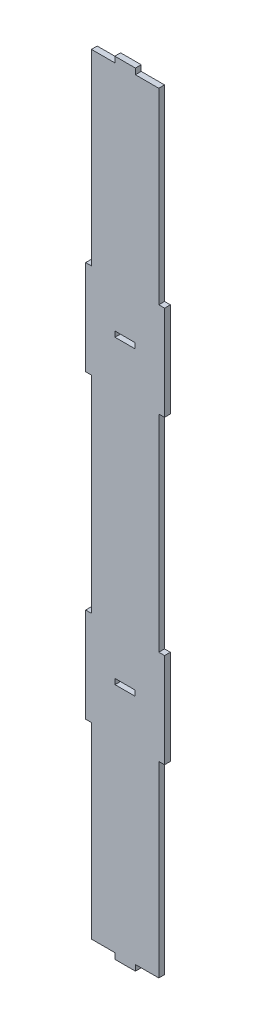
ISO-10303-21;
HEADER;
FILE_DESCRIPTION(('STEP AP214'),'2;1');
FILE_NAME('part.step','',(''),(''),'','','');
FILE_SCHEMA(('AUTOMOTIVE_DESIGN { 1 0 10303 214 1 1 1 1 }'));
ENDSEC;
DATA;
#1=APPLICATION_CONTEXT('core data for automotive mechanical design processes');
#2=APPLICATION_PROTOCOL_DEFINITION('international standard','automotive_design',2000,#1);
#3=PRODUCT_CONTEXT('',#1,'mechanical');
#4=PRODUCT('Part','Part','',(#3));
#5=PRODUCT_RELATED_PRODUCT_CATEGORY('part','',(#4));
#6=PRODUCT_DEFINITION_FORMATION('','',#4);
#7=PRODUCT_DEFINITION_CONTEXT('part definition',#1,'design');
#8=PRODUCT_DEFINITION('design','',#6,#7);
#9=PRODUCT_DEFINITION_SHAPE('','',#8);
#10=(LENGTH_UNIT() NAMED_UNIT(*) SI_UNIT(.MILLI.,.METRE.));
#11=(NAMED_UNIT(*) PLANE_ANGLE_UNIT() SI_UNIT($,.RADIAN.));
#12=(NAMED_UNIT(*) SI_UNIT($,.STERADIAN.) SOLID_ANGLE_UNIT());
#13=UNCERTAINTY_MEASURE_WITH_UNIT(LENGTH_MEASURE(1.E-05),#10,'distance_accuracy_value','');
#14=(GEOMETRIC_REPRESENTATION_CONTEXT(3) GLOBAL_UNCERTAINTY_ASSIGNED_CONTEXT((#13)) GLOBAL_UNIT_ASSIGNED_CONTEXT((#10,
#11,#12)) REPRESENTATION_CONTEXT('',''));
#15=CARTESIAN_POINT('',(0.,0.,0.));
#16=DIRECTION('',(0.,0.,1.));
#17=DIRECTION('',(1.,0.,0.));
#18=AXIS2_PLACEMENT_3D('',#15,#16,#17);
#19=CARTESIAN_POINT('',(0.,0.,4.3));
#20=DIRECTION('',(0.,0.,1.));
#21=DIRECTION('',(1.,0.,0.));
#22=AXIS2_PLACEMENT_3D('',#19,#20,#21);
#23=PLANE('',#22);
#24=DIRECTION('',(-1.,0.,0.));
#25=VECTOR('',#24,1.);
#26=CARTESIAN_POINT('',(7.64999999999997,286.,4.3));
#27=LINE('',#26,#25);
#28=CARTESIAN_POINT('',(24.9999999999999,286.,4.3));
#29=VERTEX_POINT('',#28);
#30=CARTESIAN_POINT('',(7.64999999999997,286.,4.3));
#31=VERTEX_POINT('',#30);
#32=EDGE_CURVE('E336',#29,#31,#27,.T.);
#33=ORIENTED_EDGE('',*,*,#32,.T.);
#34=DIRECTION('',(0.,1.,0.));
#35=VECTOR('',#34,1.);
#36=CARTESIAN_POINT('',(7.64999999999997,286.,4.3));
#37=LINE('',#36,#35);
#38=CARTESIAN_POINT('',(7.65000000000003,290.3,4.3));
#39=VERTEX_POINT('',#38);
#40=EDGE_CURVE('E339',#31,#39,#37,.T.);
#41=ORIENTED_EDGE('',*,*,#40,.T.);
#42=DIRECTION('',(-1.,0.,0.));
#43=VECTOR('',#42,1.);
#44=CARTESIAN_POINT('',(-7.64999999999997,290.3,4.3));
#45=LINE('',#44,#43);
#46=CARTESIAN_POINT('',(-7.64999999999997,290.3,4.3));
#47=VERTEX_POINT('',#46);
#48=EDGE_CURVE('E342',#39,#47,#45,.T.);
#49=ORIENTED_EDGE('',*,*,#48,.T.);
#50=DIRECTION('',(0.,-1.,0.));
#51=VECTOR('',#50,1.);
#52=CARTESIAN_POINT('',(-7.64999999999997,286.,4.3));
#53=LINE('',#52,#51);
#54=CARTESIAN_POINT('',(-7.64999999999997,286.,4.3));
#55=VERTEX_POINT('',#54);
#56=EDGE_CURVE('E344',#47,#55,#53,.T.);
#57=ORIENTED_EDGE('',*,*,#56,.T.);
#58=DIRECTION('',(-1.,0.,0.));
#59=VECTOR('',#58,1.);
#60=CARTESIAN_POINT('',(-24.9999999999999,286.,4.3));
#61=LINE('',#60,#59);
#62=CARTESIAN_POINT('',(-24.9999999999999,286.,4.3));
#63=VERTEX_POINT('',#62);
#64=EDGE_CURVE('E346',#55,#63,#61,.T.);
#65=ORIENTED_EDGE('',*,*,#64,.T.);
#66=DIRECTION('',(0.,-1.,0.));
#67=VECTOR('',#66,1.);
#68=CARTESIAN_POINT('',(-24.9999999999999,146.7667,4.3));
#69=LINE('',#68,#67);
#70=CARTESIAN_POINT('',(-24.9999999999999,146.7667,4.3));
#71=VERTEX_POINT('',#70);
#72=EDGE_CURVE('E348',#63,#71,#69,.T.);
#73=ORIENTED_EDGE('',*,*,#72,.T.);
#74=DIRECTION('',(-1.,0.,0.));
#75=VECTOR('',#74,1.);
#76=CARTESIAN_POINT('',(-24.9999999999999,146.7667,4.3));
#77=LINE('',#76,#75);
#78=CARTESIAN_POINT('',(-29.2999999999999,146.7667,4.3));
#79=VERTEX_POINT('',#78);
#80=EDGE_CURVE('E350',#71,#79,#77,.T.);
#81=ORIENTED_EDGE('',*,*,#80,.T.);
#82=DIRECTION('',(0.,-1.,0.));
#83=VECTOR('',#82,1.);
#84=CARTESIAN_POINT('',(-29.2999999999999,146.7667,4.3));
#85=LINE('',#84,#83);
#86=CARTESIAN_POINT('',(-29.2999999999999,76.5666999999998,4.3));
#87=VERTEX_POINT('',#86);
#88=EDGE_CURVE('E352',#79,#87,#85,.T.);
#89=ORIENTED_EDGE('',*,*,#88,.T.);
#90=DIRECTION('',(1.,0.,0.));
#91=VECTOR('',#90,1.);
#92=CARTESIAN_POINT('',(-24.9999999999999,76.5666999999998,4.3));
#93=LINE('',#92,#91);
#94=CARTESIAN_POINT('',(-24.9999999999999,76.5666999999998,4.3));
#95=VERTEX_POINT('',#94);
#96=EDGE_CURVE('E354',#87,#95,#93,.T.);
#97=ORIENTED_EDGE('',*,*,#96,.T.);
#98=DIRECTION('',(0.,-1.,0.));
#99=VECTOR('',#98,1.);
#100=CARTESIAN_POINT('',(-24.9999999999999,-76.5666000000002,4.3));
#101=LINE('',#100,#99);
#102=CARTESIAN_POINT('',(-24.9999999999999,-76.5666000000002,4.3));
#103=VERTEX_POINT('',#102);
#104=EDGE_CURVE('E356',#95,#103,#101,.T.);
#105=ORIENTED_EDGE('',*,*,#104,.T.);
#106=DIRECTION('',(-1.,0.,0.));
#107=VECTOR('',#106,1.);
#108=CARTESIAN_POINT('',(-24.9999999999999,-76.5666000000002,4.3));
#109=LINE('',#108,#107);
#110=CARTESIAN_POINT('',(-29.2999999999999,-76.5666000000002,4.3));
#111=VERTEX_POINT('',#110);
#112=EDGE_CURVE('E358',#103,#111,#109,.T.);
#113=ORIENTED_EDGE('',*,*,#112,.T.);
#114=DIRECTION('',(0.,-1.,0.));
#115=VECTOR('',#114,1.);
#116=CARTESIAN_POINT('',(-29.2999999999999,-76.5666000000002,4.3));
#117=LINE('',#116,#115);
#118=CARTESIAN_POINT('',(-29.2999999999999,-146.7666,4.3));
#119=VERTEX_POINT('',#118);
#120=EDGE_CURVE('E360',#111,#119,#117,.T.);
#121=ORIENTED_EDGE('',*,*,#120,.T.);
#122=DIRECTION('',(1.,0.,0.));
#123=VECTOR('',#122,1.);
#124=CARTESIAN_POINT('',(-24.9999999999999,-146.7666,4.3));
#125=LINE('',#124,#123);
#126=CARTESIAN_POINT('',(-24.9999999999999,-146.7666,4.3));
#127=VERTEX_POINT('',#126);
#128=EDGE_CURVE('E362',#119,#127,#125,.T.);
#129=ORIENTED_EDGE('',*,*,#128,.T.);
#130=DIRECTION('',(0.,-1.,0.));
#131=VECTOR('',#130,1.);
#132=CARTESIAN_POINT('',(-24.9999999999999,-286.,4.3));
#133=LINE('',#132,#131);
#134=CARTESIAN_POINT('',(-24.9999999999999,-286.,4.3));
#135=VERTEX_POINT('',#134);
#136=EDGE_CURVE('E364',#127,#135,#133,.T.);
#137=ORIENTED_EDGE('',*,*,#136,.T.);
#138=DIRECTION('',(1.,0.,0.));
#139=VECTOR('',#138,1.);
#140=CARTESIAN_POINT('',(-24.9999999999999,-286.,4.3));
#141=LINE('',#140,#139);
#142=CARTESIAN_POINT('',(-7.64999999999982,-286.,4.3));
#143=VERTEX_POINT('',#142);
#144=EDGE_CURVE('E366',#135,#143,#141,.T.);
#145=ORIENTED_EDGE('',*,*,#144,.T.);
#146=DIRECTION('',(0.,-1.,0.));
#147=VECTOR('',#146,1.);
#148=CARTESIAN_POINT('',(-7.64999999999982,-286.,4.3));
#149=LINE('',#148,#147);
#150=CARTESIAN_POINT('',(-7.65000000000008,-290.3,4.3));
#151=VERTEX_POINT('',#150);
#152=EDGE_CURVE('E368',#143,#151,#149,.T.);
#153=ORIENTED_EDGE('',*,*,#152,.T.);
#154=DIRECTION('',(1.,0.,0.));
#155=VECTOR('',#154,1.);
#156=CARTESIAN_POINT('',(-7.65000000000008,-290.3,4.3));
#157=LINE('',#156,#155);
#158=CARTESIAN_POINT('',(7.64999999999992,-290.3,4.3));
#159=VERTEX_POINT('',#158);
#160=EDGE_CURVE('E370',#151,#159,#157,.T.);
#161=ORIENTED_EDGE('',*,*,#160,.T.);
#162=DIRECTION('',(0.,1.,0.));
#163=VECTOR('',#162,1.);
#164=CARTESIAN_POINT('',(7.64999999999992,-286.,4.3));
#165=LINE('',#164,#163);
#166=CARTESIAN_POINT('',(7.64999999999992,-286.,4.3));
#167=VERTEX_POINT('',#166);
#168=EDGE_CURVE('E372',#159,#167,#165,.T.);
#169=ORIENTED_EDGE('',*,*,#168,.T.);
#170=DIRECTION('',(1.,0.,0.));
#171=VECTOR('',#170,1.);
#172=CARTESIAN_POINT('',(7.64999999999992,-286.,4.3));
#173=LINE('',#172,#171);
#174=CARTESIAN_POINT('',(25.0000000000001,-286.,4.3));
#175=VERTEX_POINT('',#174);
#176=EDGE_CURVE('E374',#167,#175,#173,.T.);
#177=ORIENTED_EDGE('',*,*,#176,.T.);
#178=DIRECTION('',(0.,1.,0.));
#179=VECTOR('',#178,1.);
#180=CARTESIAN_POINT('',(25.0000000000001,-286.,4.3));
#181=LINE('',#180,#179);
#182=CARTESIAN_POINT('',(25.,-146.7666,4.3));
#183=VERTEX_POINT('',#182);
#184=EDGE_CURVE('E376',#175,#183,#181,.T.);
#185=ORIENTED_EDGE('',*,*,#184,.T.);
#186=DIRECTION('',(1.,0.,0.));
#187=VECTOR('',#186,1.);
#188=CARTESIAN_POINT('',(25.,-146.7666,4.3));
#189=LINE('',#188,#187);
#190=CARTESIAN_POINT('',(29.3,-146.7666,4.3));
#191=VERTEX_POINT('',#190);
#192=EDGE_CURVE('E378',#183,#191,#189,.T.);
#193=ORIENTED_EDGE('',*,*,#192,.T.);
#194=DIRECTION('',(0.,1.,0.));
#195=VECTOR('',#194,1.);
#196=CARTESIAN_POINT('',(29.3,-76.5666000000002,4.3));
#197=LINE('',#196,#195);
#198=CARTESIAN_POINT('',(29.3,-76.5666000000002,4.3));
#199=VERTEX_POINT('',#198);
#200=EDGE_CURVE('E380',#191,#199,#197,.T.);
#201=ORIENTED_EDGE('',*,*,#200,.T.);
#202=DIRECTION('',(-1.,0.,0.));
#203=VECTOR('',#202,1.);
#204=CARTESIAN_POINT('',(25.,-76.5666000000002,4.3));
#205=LINE('',#204,#203);
#206=CARTESIAN_POINT('',(25.,-76.5666000000002,4.3));
#207=VERTEX_POINT('',#206);
#208=EDGE_CURVE('E382',#199,#207,#205,.T.);
#209=ORIENTED_EDGE('',*,*,#208,.T.);
#210=DIRECTION('',(0.,1.,0.));
#211=VECTOR('',#210,1.);
#212=CARTESIAN_POINT('',(25.,-76.5666000000002,4.3));
#213=LINE('',#212,#211);
#214=CARTESIAN_POINT('',(25.,76.5666999999998,4.3));
#215=VERTEX_POINT('',#214);
#216=EDGE_CURVE('E384',#207,#215,#213,.T.);
#217=ORIENTED_EDGE('',*,*,#216,.T.);
#218=DIRECTION('',(1.,0.,0.));
#219=VECTOR('',#218,1.);
#220=CARTESIAN_POINT('',(25.,76.5666999999998,4.3));
#221=LINE('',#220,#219);
#222=CARTESIAN_POINT('',(29.3,76.5666999999998,4.3));
#223=VERTEX_POINT('',#222);
#224=EDGE_CURVE('E386',#215,#223,#221,.T.);
#225=ORIENTED_EDGE('',*,*,#224,.T.);
#226=DIRECTION('',(0.,1.,0.));
#227=VECTOR('',#226,1.);
#228=CARTESIAN_POINT('',(29.3,146.7667,4.3));
#229=LINE('',#228,#227);
#230=CARTESIAN_POINT('',(29.3,146.7667,4.3));
#231=VERTEX_POINT('',#230);
#232=EDGE_CURVE('E388',#223,#231,#229,.T.);
#233=ORIENTED_EDGE('',*,*,#232,.T.);
#234=DIRECTION('',(-1.,0.,0.));
#235=VECTOR('',#234,1.);
#236=CARTESIAN_POINT('',(25.,146.7667,4.3));
#237=LINE('',#236,#235);
#238=CARTESIAN_POINT('',(25.,146.7667,4.3));
#239=VERTEX_POINT('',#238);
#240=EDGE_CURVE('E390',#231,#239,#237,.T.);
#241=ORIENTED_EDGE('',*,*,#240,.T.);
#242=DIRECTION('',(0.,1.,0.));
#243=VECTOR('',#242,1.);
#244=CARTESIAN_POINT('',(25.,146.7667,4.3));
#245=LINE('',#244,#243);
#246=EDGE_CURVE('E392',#239,#29,#245,.T.);
#247=ORIENTED_EDGE('',*,*,#246,.T.);
#248=EDGE_LOOP('',(#33,#41,#49,#57,#65,#73,#81,#89,#97,#105,#113,#121,#129,#137,#145,#153,#161,
#169,#177,#185,#193,#201,#209,#217,#225,#233,#241,#247));
#249=FACE_BOUND('',#248,.T.);
#250=DIRECTION('',(1.,0.,0.));
#251=VECTOR('',#250,1.);
#252=CARTESIAN_POINT('',(7.50000000000005,-113.6666,4.3));
#253=LINE('',#252,#251);
#254=CARTESIAN_POINT('',(-7.49999999999995,-113.6666,4.3));
#255=VERTEX_POINT('',#254);
#256=CARTESIAN_POINT('',(7.50000000000005,-113.6666,4.3));
#257=VERTEX_POINT('',#256);
#258=EDGE_CURVE('E307',#255,#257,#253,.T.);
#259=ORIENTED_EDGE('',*,*,#258,.F.);
#260=DIRECTION('',(0.,-1.,0.));
#261=VECTOR('',#260,1.);
#262=CARTESIAN_POINT('',(-7.49999999999995,-113.6666,4.3));
#263=LINE('',#262,#261);
#264=CARTESIAN_POINT('',(-7.49999999999995,-109.6666,4.3));
#265=VERTEX_POINT('',#264);
#266=EDGE_CURVE('E305',#265,#255,#263,.T.);
#267=ORIENTED_EDGE('',*,*,#266,.F.);
#268=DIRECTION('',(-1.,0.,0.));
#269=VECTOR('',#268,1.);
#270=CARTESIAN_POINT('',(7.50000000000005,-109.6666,4.3));
#271=LINE('',#270,#269);
#272=CARTESIAN_POINT('',(7.50000000000005,-109.6666,4.3));
#273=VERTEX_POINT('',#272);
#274=EDGE_CURVE('E313',#273,#265,#271,.T.);
#275=ORIENTED_EDGE('',*,*,#274,.F.);
#276=DIRECTION('',(0.,1.,0.));
#277=VECTOR('',#276,1.);
#278=CARTESIAN_POINT('',(7.50000000000005,-113.6666,4.3));
#279=LINE('',#278,#277);
#280=EDGE_CURVE('E310',#257,#273,#279,.T.);
#281=ORIENTED_EDGE('',*,*,#280,.F.);
#282=EDGE_LOOP('',(#259,#267,#275,#281));
#283=FACE_BOUND('',#282,.T.);
#284=DIRECTION('',(-1.,0.,0.));
#285=VECTOR('',#284,1.);
#286=CARTESIAN_POINT('',(7.50000000000002,113.6666,4.3));
#287=LINE('',#286,#285);
#288=CARTESIAN_POINT('',(7.50000000000002,113.6666,4.3));
#289=VERTEX_POINT('',#288);
#290=CARTESIAN_POINT('',(-7.49999999999998,113.6666,4.3));
#291=VERTEX_POINT('',#290);
#292=EDGE_CURVE('E277',#289,#291,#287,.T.);
#293=ORIENTED_EDGE('',*,*,#292,.F.);
#294=DIRECTION('',(0.,1.,0.));
#295=VECTOR('',#294,1.);
#296=CARTESIAN_POINT('',(7.50000000000002,113.6666,4.3));
#297=LINE('',#296,#295);
#298=CARTESIAN_POINT('',(7.50000000000002,109.6666,4.3));
#299=VERTEX_POINT('',#298);
#300=EDGE_CURVE('E269',#299,#289,#297,.T.);
#301=ORIENTED_EDGE('',*,*,#300,.F.);
#302=DIRECTION('',(1.,0.,0.));
#303=VECTOR('',#302,1.);
#304=CARTESIAN_POINT('',(7.50000000000002,109.6666,4.3));
#305=LINE('',#304,#303);
#306=CARTESIAN_POINT('',(-7.49999999999998,109.6666,4.3));
#307=VERTEX_POINT('',#306);
#308=EDGE_CURVE('E291',#307,#299,#305,.T.);
#309=ORIENTED_EDGE('',*,*,#308,.F.);
#310=DIRECTION('',(0.,-1.,0.));
#311=VECTOR('',#310,1.);
#312=CARTESIAN_POINT('',(-7.49999999999998,113.6666,4.3));
#313=LINE('',#312,#311);
#314=EDGE_CURVE('E289',#291,#307,#313,.T.);
#315=ORIENTED_EDGE('',*,*,#314,.F.);
#316=EDGE_LOOP('',(#293,#301,#309,#315));
#317=FACE_BOUND('',#316,.T.);
#318=ADVANCED_FACE('F36',(#249,#283,#317),#23,.T.);
#319=CARTESIAN_POINT('',(0.,0.,0.));
#320=DIRECTION('',(0.,0.,1.));
#321=DIRECTION('',(1.,0.,0.));
#322=AXIS2_PLACEMENT_3D('',#319,#320,#321);
#323=PLANE('',#322);
#324=DIRECTION('',(0.,-1.,0.));
#325=VECTOR('',#324,1.);
#326=CARTESIAN_POINT('',(-7.49999999999995,-113.6666,0.));
#327=LINE('',#326,#325);
#328=CARTESIAN_POINT('',(-7.49999999999995,-109.6666,0.));
#329=VERTEX_POINT('',#328);
#330=CARTESIAN_POINT('',(-7.49999999999995,-113.6666,0.));
#331=VERTEX_POINT('',#330);
#332=EDGE_CURVE('E285',#329,#331,#327,.T.);
#333=ORIENTED_EDGE('',*,*,#332,.T.);
#334=DIRECTION('',(1.,0.,0.));
#335=VECTOR('',#334,1.);
#336=CARTESIAN_POINT('',(7.50000000000005,-113.6666,0.));
#337=LINE('',#336,#335);
#338=CARTESIAN_POINT('',(7.50000000000005,-113.6666,0.));
#339=VERTEX_POINT('',#338);
#340=EDGE_CURVE('E318',#331,#339,#337,.T.);
#341=ORIENTED_EDGE('',*,*,#340,.T.);
#342=DIRECTION('',(0.,1.,0.));
#343=VECTOR('',#342,1.);
#344=CARTESIAN_POINT('',(7.50000000000005,-113.6666,0.));
#345=LINE('',#344,#343);
#346=CARTESIAN_POINT('',(7.50000000000005,-109.6666,0.));
#347=VERTEX_POINT('',#346);
#348=EDGE_CURVE('E321',#339,#347,#345,.T.);
#349=ORIENTED_EDGE('',*,*,#348,.T.);
#350=DIRECTION('',(-1.,0.,0.));
#351=VECTOR('',#350,1.);
#352=CARTESIAN_POINT('',(7.50000000000005,-109.6666,0.));
#353=LINE('',#352,#351);
#354=EDGE_CURVE('E308',#347,#329,#353,.T.);
#355=ORIENTED_EDGE('',*,*,#354,.T.);
#356=EDGE_LOOP('',(#333,#341,#349,#355));
#357=FACE_BOUND('',#356,.T.);
#358=DIRECTION('',(-1.,0.,0.));
#359=VECTOR('',#358,1.);
#360=CARTESIAN_POINT('',(7.64999999999997,286.,0.));
#361=LINE('',#360,#359);
#362=CARTESIAN_POINT('',(24.9999999999999,286.,0.));
#363=VERTEX_POINT('',#362);
#364=CARTESIAN_POINT('',(7.64999999999997,286.,0.));
#365=VERTEX_POINT('',#364);
#366=EDGE_CURVE('E335',#363,#365,#361,.T.);
#367=ORIENTED_EDGE('',*,*,#366,.F.);
#368=DIRECTION('',(0.,1.,0.));
#369=VECTOR('',#368,1.);
#370=CARTESIAN_POINT('',(25.,146.7667,0.));
#371=LINE('',#370,#369);
#372=CARTESIAN_POINT('',(25.,146.7667,0.));
#373=VERTEX_POINT('',#372);
#374=EDGE_CURVE('E340',#373,#363,#371,.T.);
#375=ORIENTED_EDGE('',*,*,#374,.F.);
#376=DIRECTION('',(-1.,0.,0.));
#377=VECTOR('',#376,1.);
#378=CARTESIAN_POINT('',(25.,146.7667,0.));
#379=LINE('',#378,#377);
#380=CARTESIAN_POINT('',(29.3,146.7667,0.));
#381=VERTEX_POINT('',#380);
#382=EDGE_CURVE('E447',#381,#373,#379,.T.);
#383=ORIENTED_EDGE('',*,*,#382,.F.);
#384=DIRECTION('',(0.,1.,0.));
#385=VECTOR('',#384,1.);
#386=CARTESIAN_POINT('',(29.3,146.7667,0.));
#387=LINE('',#386,#385);
#388=CARTESIAN_POINT('',(29.3,76.5666999999998,0.));
#389=VERTEX_POINT('',#388);
#390=EDGE_CURVE('E445',#389,#381,#387,.T.);
#391=ORIENTED_EDGE('',*,*,#390,.F.);
#392=DIRECTION('',(1.,0.,0.));
#393=VECTOR('',#392,1.);
#394=CARTESIAN_POINT('',(25.,76.5666999999998,0.));
#395=LINE('',#394,#393);
#396=CARTESIAN_POINT('',(25.,76.5666999999998,0.));
#397=VERTEX_POINT('',#396);
#398=EDGE_CURVE('E443',#397,#389,#395,.T.);
#399=ORIENTED_EDGE('',*,*,#398,.F.);
#400=DIRECTION('',(0.,1.,0.));
#401=VECTOR('',#400,1.);
#402=CARTESIAN_POINT('',(25.,-76.5666000000002,0.));
#403=LINE('',#402,#401);
#404=CARTESIAN_POINT('',(25.,-76.5666000000002,0.));
#405=VERTEX_POINT('',#404);
#406=EDGE_CURVE('E441',#405,#397,#403,.T.);
#407=ORIENTED_EDGE('',*,*,#406,.F.);
#408=DIRECTION('',(-1.,0.,0.));
#409=VECTOR('',#408,1.);
#410=CARTESIAN_POINT('',(25.,-76.5666000000002,0.));
#411=LINE('',#410,#409);
#412=CARTESIAN_POINT('',(29.3,-76.5666000000002,0.));
#413=VERTEX_POINT('',#412);
#414=EDGE_CURVE('E439',#413,#405,#411,.T.);
#415=ORIENTED_EDGE('',*,*,#414,.F.);
#416=DIRECTION('',(0.,1.,0.));
#417=VECTOR('',#416,1.);
#418=CARTESIAN_POINT('',(29.3,-76.5666000000002,0.));
#419=LINE('',#418,#417);
#420=CARTESIAN_POINT('',(29.3,-146.7666,0.));
#421=VERTEX_POINT('',#420);
#422=EDGE_CURVE('E437',#421,#413,#419,.T.);
#423=ORIENTED_EDGE('',*,*,#422,.F.);
#424=DIRECTION('',(1.,0.,0.));
#425=VECTOR('',#424,1.);
#426=CARTESIAN_POINT('',(25.,-146.7666,0.));
#427=LINE('',#426,#425);
#428=CARTESIAN_POINT('',(25.,-146.7666,0.));
#429=VERTEX_POINT('',#428);
#430=EDGE_CURVE('E435',#429,#421,#427,.T.);
#431=ORIENTED_EDGE('',*,*,#430,.F.);
#432=DIRECTION('',(0.,1.,0.));
#433=VECTOR('',#432,1.);
#434=CARTESIAN_POINT('',(25.0000000000001,-286.,0.));
#435=LINE('',#434,#433);
#436=CARTESIAN_POINT('',(25.0000000000001,-286.,0.));
#437=VERTEX_POINT('',#436);
#438=EDGE_CURVE('E433',#437,#429,#435,.T.);
#439=ORIENTED_EDGE('',*,*,#438,.F.);
#440=DIRECTION('',(1.,0.,0.));
#441=VECTOR('',#440,1.);
#442=CARTESIAN_POINT('',(7.64999999999992,-286.,0.));
#443=LINE('',#442,#441);
#444=CARTESIAN_POINT('',(7.64999999999992,-286.,0.));
#445=VERTEX_POINT('',#444);
#446=EDGE_CURVE('E431',#445,#437,#443,.T.);
#447=ORIENTED_EDGE('',*,*,#446,.F.);
#448=DIRECTION('',(0.,1.,0.));
#449=VECTOR('',#448,1.);
#450=CARTESIAN_POINT('',(7.64999999999992,-286.,0.));
#451=LINE('',#450,#449);
#452=CARTESIAN_POINT('',(7.64999999999992,-290.3,0.));
#453=VERTEX_POINT('',#452);
#454=EDGE_CURVE('E429',#453,#445,#451,.T.);
#455=ORIENTED_EDGE('',*,*,#454,.F.);
#456=DIRECTION('',(1.,0.,0.));
#457=VECTOR('',#456,1.);
#458=CARTESIAN_POINT('',(-7.65000000000008,-290.3,0.));
#459=LINE('',#458,#457);
#460=CARTESIAN_POINT('',(-7.65000000000008,-290.3,0.));
#461=VERTEX_POINT('',#460);
#462=EDGE_CURVE('E427',#461,#453,#459,.T.);
#463=ORIENTED_EDGE('',*,*,#462,.F.);
#464=DIRECTION('',(0.,-1.,0.));
#465=VECTOR('',#464,1.);
#466=CARTESIAN_POINT('',(-7.64999999999982,-286.,0.));
#467=LINE('',#466,#465);
#468=CARTESIAN_POINT('',(-7.64999999999982,-286.,0.));
#469=VERTEX_POINT('',#468);
#470=EDGE_CURVE('E425',#469,#461,#467,.T.);
#471=ORIENTED_EDGE('',*,*,#470,.F.);
#472=DIRECTION('',(1.,0.,0.));
#473=VECTOR('',#472,1.);
#474=CARTESIAN_POINT('',(-24.9999999999999,-286.,0.));
#475=LINE('',#474,#473);
#476=CARTESIAN_POINT('',(-24.9999999999999,-286.,0.));
#477=VERTEX_POINT('',#476);
#478=EDGE_CURVE('E423',#477,#469,#475,.T.);
#479=ORIENTED_EDGE('',*,*,#478,.F.);
#480=DIRECTION('',(0.,-1.,0.));
#481=VECTOR('',#480,1.);
#482=CARTESIAN_POINT('',(-24.9999999999999,-286.,0.));
#483=LINE('',#482,#481);
#484=CARTESIAN_POINT('',(-24.9999999999999,-146.7666,0.));
#485=VERTEX_POINT('',#484);
#486=EDGE_CURVE('E421',#485,#477,#483,.T.);
#487=ORIENTED_EDGE('',*,*,#486,.F.);
#488=DIRECTION('',(1.,0.,0.));
#489=VECTOR('',#488,1.);
#490=CARTESIAN_POINT('',(-24.9999999999999,-146.7666,0.));
#491=LINE('',#490,#489);
#492=CARTESIAN_POINT('',(-29.2999999999999,-146.7666,0.));
#493=VERTEX_POINT('',#492);
#494=EDGE_CURVE('E419',#493,#485,#491,.T.);
#495=ORIENTED_EDGE('',*,*,#494,.F.);
#496=DIRECTION('',(0.,-1.,0.));
#497=VECTOR('',#496,1.);
#498=CARTESIAN_POINT('',(-29.2999999999999,-76.5666000000002,0.));
#499=LINE('',#498,#497);
#500=CARTESIAN_POINT('',(-29.2999999999999,-76.5666000000002,0.));
#501=VERTEX_POINT('',#500);
#502=EDGE_CURVE('E417',#501,#493,#499,.T.);
#503=ORIENTED_EDGE('',*,*,#502,.F.);
#504=DIRECTION('',(-1.,0.,0.));
#505=VECTOR('',#504,1.);
#506=CARTESIAN_POINT('',(-24.9999999999999,-76.5666000000002,0.));
#507=LINE('',#506,#505);
#508=CARTESIAN_POINT('',(-24.9999999999999,-76.5666000000002,0.));
#509=VERTEX_POINT('',#508);
#510=EDGE_CURVE('E415',#509,#501,#507,.T.);
#511=ORIENTED_EDGE('',*,*,#510,.F.);
#512=DIRECTION('',(0.,-1.,0.));
#513=VECTOR('',#512,1.);
#514=CARTESIAN_POINT('',(-24.9999999999999,-76.5666000000002,0.));
#515=LINE('',#514,#513);
#516=CARTESIAN_POINT('',(-24.9999999999999,76.5666999999998,0.));
#517=VERTEX_POINT('',#516);
#518=EDGE_CURVE('E413',#517,#509,#515,.T.);
#519=ORIENTED_EDGE('',*,*,#518,.F.);
#520=DIRECTION('',(1.,0.,0.));
#521=VECTOR('',#520,1.);
#522=CARTESIAN_POINT('',(-24.9999999999999,76.5666999999998,0.));
#523=LINE('',#522,#521);
#524=CARTESIAN_POINT('',(-29.2999999999999,76.5666999999998,0.));
#525=VERTEX_POINT('',#524);
#526=EDGE_CURVE('E411',#525,#517,#523,.T.);
#527=ORIENTED_EDGE('',*,*,#526,.F.);
#528=DIRECTION('',(0.,-1.,0.));
#529=VECTOR('',#528,1.);
#530=CARTESIAN_POINT('',(-29.2999999999999,146.7667,0.));
#531=LINE('',#530,#529);
#532=CARTESIAN_POINT('',(-29.2999999999999,146.7667,0.));
#533=VERTEX_POINT('',#532);
#534=EDGE_CURVE('E409',#533,#525,#531,.T.);
#535=ORIENTED_EDGE('',*,*,#534,.F.);
#536=DIRECTION('',(-1.,0.,0.));
#537=VECTOR('',#536,1.);
#538=CARTESIAN_POINT('',(-24.9999999999999,146.7667,0.));
#539=LINE('',#538,#537);
#540=CARTESIAN_POINT('',(-24.9999999999999,146.7667,0.));
#541=VERTEX_POINT('',#540);
#542=EDGE_CURVE('E407',#541,#533,#539,.T.);
#543=ORIENTED_EDGE('',*,*,#542,.F.);
#544=DIRECTION('',(0.,-1.,0.));
#545=VECTOR('',#544,1.);
#546=CARTESIAN_POINT('',(-24.9999999999999,146.7667,0.));
#547=LINE('',#546,#545);
#548=CARTESIAN_POINT('',(-24.9999999999999,286.,0.));
#549=VERTEX_POINT('',#548);
#550=EDGE_CURVE('E405',#549,#541,#547,.T.);
#551=ORIENTED_EDGE('',*,*,#550,.F.);
#552=DIRECTION('',(-1.,0.,0.));
#553=VECTOR('',#552,1.);
#554=CARTESIAN_POINT('',(-24.9999999999999,286.,0.));
#555=LINE('',#554,#553);
#556=CARTESIAN_POINT('',(-7.64999999999997,286.,0.));
#557=VERTEX_POINT('',#556);
#558=EDGE_CURVE('E403',#557,#549,#555,.T.);
#559=ORIENTED_EDGE('',*,*,#558,.F.);
#560=DIRECTION('',(0.,-1.,0.));
#561=VECTOR('',#560,1.);
#562=CARTESIAN_POINT('',(-7.64999999999997,286.,0.));
#563=LINE('',#562,#561);
#564=CARTESIAN_POINT('',(-7.64999999999997,290.3,0.));
#565=VERTEX_POINT('',#564);
#566=EDGE_CURVE('E401',#565,#557,#563,.T.);
#567=ORIENTED_EDGE('',*,*,#566,.F.);
#568=DIRECTION('',(-1.,0.,0.));
#569=VECTOR('',#568,1.);
#570=CARTESIAN_POINT('',(-7.64999999999997,290.3,0.));
#571=LINE('',#570,#569);
#572=CARTESIAN_POINT('',(7.65000000000003,290.3,0.));
#573=VERTEX_POINT('',#572);
#574=EDGE_CURVE('E399',#573,#565,#571,.T.);
#575=ORIENTED_EDGE('',*,*,#574,.F.);
#576=DIRECTION('',(0.,1.,0.));
#577=VECTOR('',#576,1.);
#578=CARTESIAN_POINT('',(7.64999999999997,286.,0.));
#579=LINE('',#578,#577);
#580=EDGE_CURVE('E397',#365,#573,#579,.T.);
#581=ORIENTED_EDGE('',*,*,#580,.F.);
#582=EDGE_LOOP('',(#367,#375,#383,#391,#399,#407,#415,#423,#431,#439,#447,#455,#463,#471,#479,
#487,#495,#503,#511,#519,#527,#535,#543,#551,#559,#567,#575,#581));
#583=FACE_BOUND('',#582,.T.);
#584=DIRECTION('',(0.,1.,0.));
#585=VECTOR('',#584,1.);
#586=CARTESIAN_POINT('',(7.50000000000002,113.6666,0.));
#587=LINE('',#586,#585);
#588=CARTESIAN_POINT('',(7.50000000000002,109.6666,0.));
#589=VERTEX_POINT('',#588);
#590=CARTESIAN_POINT('',(7.50000000000002,113.6666,0.));
#591=VERTEX_POINT('',#590);
#592=EDGE_CURVE('E59',#589,#591,#587,.T.);
#593=ORIENTED_EDGE('',*,*,#592,.T.);
#594=DIRECTION('',(-1.,0.,0.));
#595=VECTOR('',#594,1.);
#596=CARTESIAN_POINT('',(7.50000000000002,113.6666,0.));
#597=LINE('',#596,#595);
#598=CARTESIAN_POINT('',(-7.49999999999998,113.6666,0.));
#599=VERTEX_POINT('',#598);
#600=EDGE_CURVE('E284',#591,#599,#597,.T.);
#601=ORIENTED_EDGE('',*,*,#600,.T.);
#602=DIRECTION('',(0.,-1.,0.));
#603=VECTOR('',#602,1.);
#604=CARTESIAN_POINT('',(-7.49999999999998,113.6666,0.));
#605=LINE('',#604,#603);
#606=CARTESIAN_POINT('',(-7.49999999999998,109.6666,0.));
#607=VERTEX_POINT('',#606);
#608=EDGE_CURVE('E297',#599,#607,#605,.T.);
#609=ORIENTED_EDGE('',*,*,#608,.T.);
#610=DIRECTION('',(1.,0.,0.));
#611=VECTOR('',#610,1.);
#612=CARTESIAN_POINT('',(7.50000000000002,109.6666,0.));
#613=LINE('',#612,#611);
#614=EDGE_CURVE('E278',#607,#589,#613,.T.);
#615=ORIENTED_EDGE('',*,*,#614,.T.);
#616=EDGE_LOOP('',(#593,#601,#609,#615));
#617=FACE_BOUND('',#616,.T.);
#618=ADVANCED_FACE('F537',(#357,#583,#617),#323,.F.);
#619=CARTESIAN_POINT('',(7.64999999999997,286.,4.3));
#620=DIRECTION('',(0.,-1.,0.));
#621=DIRECTION('',(0.,0.,-1.));
#622=AXIS2_PLACEMENT_3D('',#619,#620,#621);
#623=PLANE('',#622);
#624=ORIENTED_EDGE('',*,*,#366,.T.);
#625=DIRECTION('',(0.,0.,-1.));
#626=VECTOR('',#625,1.);
#627=CARTESIAN_POINT('',(7.64999999999997,286.,4.3));
#628=LINE('',#627,#626);
#629=EDGE_CURVE('E11',#31,#365,#628,.T.);
#630=ORIENTED_EDGE('',*,*,#629,.F.);
#631=ORIENTED_EDGE('',*,*,#32,.F.);
#632=DIRECTION('',(0.,0.,-1.));
#633=VECTOR('',#632,1.);
#634=CARTESIAN_POINT('',(24.9999999999999,286.,4.3));
#635=LINE('',#634,#633);
#636=EDGE_CURVE('E394',#29,#363,#635,.T.);
#637=ORIENTED_EDGE('',*,*,#636,.T.);
#638=EDGE_LOOP('',(#624,#630,#631,#637));
#639=FACE_BOUND('',#638,.T.);
#640=ADVANCED_FACE('F38',(#639),#623,.F.);
#641=CARTESIAN_POINT('',(7.64999999999997,286.,4.3));
#642=DIRECTION('',(-1.,0.,0.));
#643=DIRECTION('',(0.,-1.,0.));
#644=AXIS2_PLACEMENT_3D('',#641,#642,#643);
#645=PLANE('',#644);
#646=ORIENTED_EDGE('',*,*,#580,.T.);
#647=DIRECTION('',(0.,0.,-1.));
#648=VECTOR('',#647,1.);
#649=CARTESIAN_POINT('',(7.65000000000003,290.3,4.3));
#650=LINE('',#649,#648);
#651=EDGE_CURVE('E44',#39,#573,#650,.T.);
#652=ORIENTED_EDGE('',*,*,#651,.F.);
#653=ORIENTED_EDGE('',*,*,#40,.F.);
#654=ORIENTED_EDGE('',*,*,#629,.T.);
#655=EDGE_LOOP('',(#646,#652,#653,#654));
#656=FACE_BOUND('',#655,.T.);
#657=ADVANCED_FACE('F555',(#656),#645,.F.);
#658=CARTESIAN_POINT('',(-7.64999999999997,290.3,4.3));
#659=DIRECTION('',(0.,-1.,0.));
#660=DIRECTION('',(0.,0.,-1.));
#661=AXIS2_PLACEMENT_3D('',#658,#659,#660);
#662=PLANE('',#661);
#663=ORIENTED_EDGE('',*,*,#574,.T.);
#664=DIRECTION('',(0.,0.,-1.));
#665=VECTOR('',#664,1.);
#666=CARTESIAN_POINT('',(-7.64999999999997,290.3,4.3));
#667=LINE('',#666,#665);
#668=EDGE_CURVE('E524',#47,#565,#667,.T.);
#669=ORIENTED_EDGE('',*,*,#668,.F.);
#670=ORIENTED_EDGE('',*,*,#48,.F.);
#671=ORIENTED_EDGE('',*,*,#651,.T.);
#672=EDGE_LOOP('',(#663,#669,#670,#671));
#673=FACE_BOUND('',#672,.T.);
#674=ADVANCED_FACE('F531',(#673),#662,.F.);
#675=CARTESIAN_POINT('',(-7.64999999999997,286.,4.3));
#676=DIRECTION('',(1.,0.,0.));
#677=DIRECTION('',(0.,0.,-1.));
#678=AXIS2_PLACEMENT_3D('',#675,#676,#677);
#679=PLANE('',#678);
#680=ORIENTED_EDGE('',*,*,#566,.T.);
#681=DIRECTION('',(0.,0.,-1.));
#682=VECTOR('',#681,1.);
#683=CARTESIAN_POINT('',(-7.64999999999997,286.,4.3));
#684=LINE('',#683,#682);
#685=EDGE_CURVE('E521',#55,#557,#684,.T.);
#686=ORIENTED_EDGE('',*,*,#685,.F.);
#687=ORIENTED_EDGE('',*,*,#56,.F.);
#688=ORIENTED_EDGE('',*,*,#668,.T.);
#689=EDGE_LOOP('',(#680,#686,#687,#688));
#690=FACE_BOUND('',#689,.T.);
#691=ADVANCED_FACE('F543',(#690),#679,.F.);
#692=CARTESIAN_POINT('',(-24.9999999999999,286.,4.3));
#693=DIRECTION('',(0.,-1.,0.));
#694=DIRECTION('',(0.,0.,-1.));
#695=AXIS2_PLACEMENT_3D('',#692,#693,#694);
#696=PLANE('',#695);
#697=ORIENTED_EDGE('',*,*,#558,.T.);
#698=DIRECTION('',(0.,0.,-1.));
#699=VECTOR('',#698,1.);
#700=CARTESIAN_POINT('',(-24.9999999999999,286.,4.3));
#701=LINE('',#700,#699);
#702=EDGE_CURVE('E518',#63,#549,#701,.T.);
#703=ORIENTED_EDGE('',*,*,#702,.F.);
#704=ORIENTED_EDGE('',*,*,#64,.F.);
#705=ORIENTED_EDGE('',*,*,#685,.T.);
#706=EDGE_LOOP('',(#697,#703,#704,#705));
#707=FACE_BOUND('',#706,.T.);
#708=ADVANCED_FACE('F547',(#707),#696,.F.);
#709=CARTESIAN_POINT('',(-24.9999999999999,146.7667,4.3));
#710=DIRECTION('',(1.,0.,0.));
#711=DIRECTION('',(0.,1.,0.));
#712=AXIS2_PLACEMENT_3D('',#709,#710,#711);
#713=PLANE('',#712);
#714=ORIENTED_EDGE('',*,*,#550,.T.);
#715=DIRECTION('',(0.,0.,-1.));
#716=VECTOR('',#715,1.);
#717=CARTESIAN_POINT('',(-24.9999999999999,146.7667,4.3));
#718=LINE('',#717,#716);
#719=EDGE_CURVE('E515',#71,#541,#718,.T.);
#720=ORIENTED_EDGE('',*,*,#719,.F.);
#721=ORIENTED_EDGE('',*,*,#72,.F.);
#722=ORIENTED_EDGE('',*,*,#702,.T.);
#723=EDGE_LOOP('',(#714,#720,#721,#722));
#724=FACE_BOUND('',#723,.T.);
#725=ADVANCED_FACE('F668',(#724),#713,.F.);
#726=CARTESIAN_POINT('',(-24.9999999999999,146.7667,4.3));
#727=DIRECTION('',(0.,-1.,0.));
#728=DIRECTION('',(0.,0.,-1.));
#729=AXIS2_PLACEMENT_3D('',#726,#727,#728);
#730=PLANE('',#729);
#731=ORIENTED_EDGE('',*,*,#542,.T.);
#732=DIRECTION('',(0.,0.,-1.));
#733=VECTOR('',#732,1.);
#734=CARTESIAN_POINT('',(-29.2999999999999,146.7667,4.3));
#735=LINE('',#734,#733);
#736=EDGE_CURVE('E512',#79,#533,#735,.T.);
#737=ORIENTED_EDGE('',*,*,#736,.F.);
#738=ORIENTED_EDGE('',*,*,#80,.F.);
#739=ORIENTED_EDGE('',*,*,#719,.T.);
#740=EDGE_LOOP('',(#731,#737,#738,#739));
#741=FACE_BOUND('',#740,.T.);
#742=ADVANCED_FACE('F665',(#741),#730,.F.);
#743=CARTESIAN_POINT('',(-29.2999999999999,146.7667,4.3));
#744=DIRECTION('',(1.,0.,0.));
#745=DIRECTION('',(0.,0.,-1.));
#746=AXIS2_PLACEMENT_3D('',#743,#744,#745);
#747=PLANE('',#746);
#748=ORIENTED_EDGE('',*,*,#534,.T.);
#749=DIRECTION('',(0.,0.,-1.));
#750=VECTOR('',#749,1.);
#751=CARTESIAN_POINT('',(-29.2999999999999,76.5666999999998,4.3));
#752=LINE('',#751,#750);
#753=EDGE_CURVE('E509',#87,#525,#752,.T.);
#754=ORIENTED_EDGE('',*,*,#753,.F.);
#755=ORIENTED_EDGE('',*,*,#88,.F.);
#756=ORIENTED_EDGE('',*,*,#736,.T.);
#757=EDGE_LOOP('',(#748,#754,#755,#756));
#758=FACE_BOUND('',#757,.T.);
#759=ADVANCED_FACE('F661',(#758),#747,.F.);
#760=CARTESIAN_POINT('',(-24.9999999999999,76.5666999999998,4.3));
#761=DIRECTION('',(0.,1.,0.));
#762=DIRECTION('',(-1.,0.,0.));
#763=AXIS2_PLACEMENT_3D('',#760,#761,#762);
#764=PLANE('',#763);
#765=ORIENTED_EDGE('',*,*,#526,.T.);
#766=DIRECTION('',(0.,0.,-1.));
#767=VECTOR('',#766,1.);
#768=CARTESIAN_POINT('',(-24.9999999999999,76.5666999999998,4.3));
#769=LINE('',#768,#767);
#770=EDGE_CURVE('E506',#95,#517,#769,.T.);
#771=ORIENTED_EDGE('',*,*,#770,.F.);
#772=ORIENTED_EDGE('',*,*,#96,.F.);
#773=ORIENTED_EDGE('',*,*,#753,.T.);
#774=EDGE_LOOP('',(#765,#771,#772,#773));
#775=FACE_BOUND('',#774,.T.);
#776=ADVANCED_FACE('F657',(#775),#764,.F.);
#777=CARTESIAN_POINT('',(-24.9999999999999,-76.5666000000002,4.3));
#778=DIRECTION('',(1.,0.,0.));
#779=DIRECTION('',(0.,0.,-1.));
#780=AXIS2_PLACEMENT_3D('',#777,#778,#779);
#781=PLANE('',#780);
#782=ORIENTED_EDGE('',*,*,#518,.T.);
#783=DIRECTION('',(0.,0.,-1.));
#784=VECTOR('',#783,1.);
#785=CARTESIAN_POINT('',(-24.9999999999999,-76.5666000000002,4.3));
#786=LINE('',#785,#784);
#787=EDGE_CURVE('E503',#103,#509,#786,.T.);
#788=ORIENTED_EDGE('',*,*,#787,.F.);
#789=ORIENTED_EDGE('',*,*,#104,.F.);
#790=ORIENTED_EDGE('',*,*,#770,.T.);
#791=EDGE_LOOP('',(#782,#788,#789,#790));
#792=FACE_BOUND('',#791,.T.);
#793=ADVANCED_FACE('F652',(#792),#781,.F.);
#794=CARTESIAN_POINT('',(-24.9999999999999,-76.5666000000002,4.3));
#795=DIRECTION('',(0.,-1.,0.));
#796=DIRECTION('',(0.,0.,-1.));
#797=AXIS2_PLACEMENT_3D('',#794,#795,#796);
#798=PLANE('',#797);
#799=ORIENTED_EDGE('',*,*,#510,.T.);
#800=DIRECTION('',(0.,0.,-1.));
#801=VECTOR('',#800,1.);
#802=CARTESIAN_POINT('',(-29.2999999999999,-76.5666000000002,4.3));
#803=LINE('',#802,#801);
#804=EDGE_CURVE('E500',#111,#501,#803,.T.);
#805=ORIENTED_EDGE('',*,*,#804,.F.);
#806=ORIENTED_EDGE('',*,*,#112,.F.);
#807=ORIENTED_EDGE('',*,*,#787,.T.);
#808=EDGE_LOOP('',(#799,#805,#806,#807));
#809=FACE_BOUND('',#808,.T.);
#810=ADVANCED_FACE('F646',(#809),#798,.F.);
#811=CARTESIAN_POINT('',(-29.2999999999999,-76.5666000000002,4.3));
#812=DIRECTION('',(1.,0.,0.));
#813=DIRECTION('',(0.,0.,-1.));
#814=AXIS2_PLACEMENT_3D('',#811,#812,#813);
#815=PLANE('',#814);
#816=ORIENTED_EDGE('',*,*,#502,.T.);
#817=DIRECTION('',(0.,0.,-1.));
#818=VECTOR('',#817,1.);
#819=CARTESIAN_POINT('',(-29.2999999999999,-146.7666,4.3));
#820=LINE('',#819,#818);
#821=EDGE_CURVE('E497',#119,#493,#820,.T.);
#822=ORIENTED_EDGE('',*,*,#821,.F.);
#823=ORIENTED_EDGE('',*,*,#120,.F.);
#824=ORIENTED_EDGE('',*,*,#804,.T.);
#825=EDGE_LOOP('',(#816,#822,#823,#824));
#826=FACE_BOUND('',#825,.T.);
#827=ADVANCED_FACE('F642',(#826),#815,.F.);
#828=CARTESIAN_POINT('',(-24.9999999999999,-146.7666,4.3));
#829=DIRECTION('',(0.,1.,0.));
#830=DIRECTION('',(0.,0.,1.));
#831=AXIS2_PLACEMENT_3D('',#828,#829,#830);
#832=PLANE('',#831);
#833=ORIENTED_EDGE('',*,*,#494,.T.);
#834=DIRECTION('',(0.,0.,-1.));
#835=VECTOR('',#834,1.);
#836=CARTESIAN_POINT('',(-24.9999999999999,-146.7666,4.3));
#837=LINE('',#836,#835);
#838=EDGE_CURVE('E494',#127,#485,#837,.T.);
#839=ORIENTED_EDGE('',*,*,#838,.F.);
#840=ORIENTED_EDGE('',*,*,#128,.F.);
#841=ORIENTED_EDGE('',*,*,#821,.T.);
#842=EDGE_LOOP('',(#833,#839,#840,#841));
#843=FACE_BOUND('',#842,.T.);
#844=ADVANCED_FACE('F637',(#843),#832,.F.);
#845=CARTESIAN_POINT('',(-24.9999999999999,-286.,4.3));
#846=DIRECTION('',(1.,0.,0.));
#847=DIRECTION('',(0.,0.,-1.));
#848=AXIS2_PLACEMENT_3D('',#845,#846,#847);
#849=PLANE('',#848);
#850=ORIENTED_EDGE('',*,*,#486,.T.);
#851=DIRECTION('',(0.,0.,-1.));
#852=VECTOR('',#851,1.);
#853=CARTESIAN_POINT('',(-24.9999999999999,-286.,4.3));
#854=LINE('',#853,#852);
#855=EDGE_CURVE('E491',#135,#477,#854,.T.);
#856=ORIENTED_EDGE('',*,*,#855,.F.);
#857=ORIENTED_EDGE('',*,*,#136,.F.);
#858=ORIENTED_EDGE('',*,*,#838,.T.);
#859=EDGE_LOOP('',(#850,#856,#857,#858));
#860=FACE_BOUND('',#859,.T.);
#861=ADVANCED_FACE('F631',(#860),#849,.F.);
#862=CARTESIAN_POINT('',(-24.9999999999999,-286.,4.3));
#863=DIRECTION('',(0.,1.,0.));
#864=DIRECTION('',(0.,0.,1.));
#865=AXIS2_PLACEMENT_3D('',#862,#863,#864);
#866=PLANE('',#865);
#867=ORIENTED_EDGE('',*,*,#478,.T.);
#868=DIRECTION('',(0.,0.,-1.));
#869=VECTOR('',#868,1.);
#870=CARTESIAN_POINT('',(-7.64999999999982,-286.,4.3));
#871=LINE('',#870,#869);
#872=EDGE_CURVE('E488',#143,#469,#871,.T.);
#873=ORIENTED_EDGE('',*,*,#872,.F.);
#874=ORIENTED_EDGE('',*,*,#144,.F.);
#875=ORIENTED_EDGE('',*,*,#855,.T.);
#876=EDGE_LOOP('',(#867,#873,#874,#875));
#877=FACE_BOUND('',#876,.T.);
#878=ADVANCED_FACE('F627',(#877),#866,.F.);
#879=CARTESIAN_POINT('',(-7.64999999999982,-286.,4.3));
#880=DIRECTION('',(1.,0.,0.));
#881=DIRECTION('',(0.,1.,0.));
#882=AXIS2_PLACEMENT_3D('',#879,#880,#881);
#883=PLANE('',#882);
#884=ORIENTED_EDGE('',*,*,#470,.T.);
#885=DIRECTION('',(0.,0.,-1.));
#886=VECTOR('',#885,1.);
#887=CARTESIAN_POINT('',(-7.65000000000008,-290.3,4.3));
#888=LINE('',#887,#886);
#889=EDGE_CURVE('E485',#151,#461,#888,.T.);
#890=ORIENTED_EDGE('',*,*,#889,.F.);
#891=ORIENTED_EDGE('',*,*,#152,.F.);
#892=ORIENTED_EDGE('',*,*,#872,.T.);
#893=EDGE_LOOP('',(#884,#890,#891,#892));
#894=FACE_BOUND('',#893,.T.);
#895=ADVANCED_FACE('F622',(#894),#883,.F.);
#896=CARTESIAN_POINT('',(-7.65000000000008,-290.3,4.3));
#897=DIRECTION('',(0.,1.,0.));
#898=DIRECTION('',(0.,0.,1.));
#899=AXIS2_PLACEMENT_3D('',#896,#897,#898);
#900=PLANE('',#899);
#901=ORIENTED_EDGE('',*,*,#462,.T.);
#902=DIRECTION('',(0.,0.,-1.));
#903=VECTOR('',#902,1.);
#904=CARTESIAN_POINT('',(7.64999999999992,-290.3,4.3));
#905=LINE('',#904,#903);
#906=EDGE_CURVE('E482',#159,#453,#905,.T.);
#907=ORIENTED_EDGE('',*,*,#906,.F.);
#908=ORIENTED_EDGE('',*,*,#160,.F.);
#909=ORIENTED_EDGE('',*,*,#889,.T.);
#910=EDGE_LOOP('',(#901,#907,#908,#909));
#911=FACE_BOUND('',#910,.T.);
#912=ADVANCED_FACE('F616',(#911),#900,.F.);
#913=CARTESIAN_POINT('',(7.64999999999992,-286.,4.3));
#914=DIRECTION('',(-1.,0.,0.));
#915=DIRECTION('',(0.,-1.,0.));
#916=AXIS2_PLACEMENT_3D('',#913,#914,#915);
#917=PLANE('',#916);
#918=ORIENTED_EDGE('',*,*,#454,.T.);
#919=DIRECTION('',(0.,0.,-1.));
#920=VECTOR('',#919,1.);
#921=CARTESIAN_POINT('',(7.64999999999992,-286.,4.3));
#922=LINE('',#921,#920);
#923=EDGE_CURVE('E479',#167,#445,#922,.T.);
#924=ORIENTED_EDGE('',*,*,#923,.F.);
#925=ORIENTED_EDGE('',*,*,#168,.F.);
#926=ORIENTED_EDGE('',*,*,#906,.T.);
#927=EDGE_LOOP('',(#918,#924,#925,#926));
#928=FACE_BOUND('',#927,.T.);
#929=ADVANCED_FACE('F612',(#928),#917,.F.);
#930=CARTESIAN_POINT('',(7.64999999999992,-286.,4.3));
#931=DIRECTION('',(0.,1.,0.));
#932=DIRECTION('',(0.,0.,1.));
#933=AXIS2_PLACEMENT_3D('',#930,#931,#932);
#934=PLANE('',#933);
#935=ORIENTED_EDGE('',*,*,#446,.T.);
#936=DIRECTION('',(0.,0.,-1.));
#937=VECTOR('',#936,1.);
#938=CARTESIAN_POINT('',(25.0000000000001,-286.,4.3));
#939=LINE('',#938,#937);
#940=EDGE_CURVE('E476',#175,#437,#939,.T.);
#941=ORIENTED_EDGE('',*,*,#940,.F.);
#942=ORIENTED_EDGE('',*,*,#176,.F.);
#943=ORIENTED_EDGE('',*,*,#923,.T.);
#944=EDGE_LOOP('',(#935,#941,#942,#943));
#945=FACE_BOUND('',#944,.T.);
#946=ADVANCED_FACE('F607',(#945),#934,.F.);
#947=CARTESIAN_POINT('',(25.0000000000001,-286.,4.3));
#948=DIRECTION('',(-1.,0.,0.));
#949=DIRECTION('',(0.,-1.,0.));
#950=AXIS2_PLACEMENT_3D('',#947,#948,#949);
#951=PLANE('',#950);
#952=ORIENTED_EDGE('',*,*,#438,.T.);
#953=DIRECTION('',(0.,0.,-1.));
#954=VECTOR('',#953,1.);
#955=CARTESIAN_POINT('',(25.,-146.7666,4.3));
#956=LINE('',#955,#954);
#957=EDGE_CURVE('E473',#183,#429,#956,.T.);
#958=ORIENTED_EDGE('',*,*,#957,.F.);
#959=ORIENTED_EDGE('',*,*,#184,.F.);
#960=ORIENTED_EDGE('',*,*,#940,.T.);
#961=EDGE_LOOP('',(#952,#958,#959,#960));
#962=FACE_BOUND('',#961,.T.);
#963=ADVANCED_FACE('F601',(#962),#951,.F.);
#964=CARTESIAN_POINT('',(25.,-146.7666,4.3));
#965=DIRECTION('',(0.,1.,0.));
#966=DIRECTION('',(0.,0.,1.));
#967=AXIS2_PLACEMENT_3D('',#964,#965,#966);
#968=PLANE('',#967);
#969=ORIENTED_EDGE('',*,*,#430,.T.);
#970=DIRECTION('',(0.,0.,-1.));
#971=VECTOR('',#970,1.);
#972=CARTESIAN_POINT('',(29.3,-146.7666,4.3));
#973=LINE('',#972,#971);
#974=EDGE_CURVE('E470',#191,#421,#973,.T.);
#975=ORIENTED_EDGE('',*,*,#974,.F.);
#976=ORIENTED_EDGE('',*,*,#192,.F.);
#977=ORIENTED_EDGE('',*,*,#957,.T.);
#978=EDGE_LOOP('',(#969,#975,#976,#977));
#979=FACE_BOUND('',#978,.T.);
#980=ADVANCED_FACE('F597',(#979),#968,.F.);
#981=CARTESIAN_POINT('',(29.3,-76.5666000000002,4.3));
#982=DIRECTION('',(-1.,0.,0.));
#983=DIRECTION('',(0.,-1.,0.));
#984=AXIS2_PLACEMENT_3D('',#981,#982,#983);
#985=PLANE('',#984);
#986=ORIENTED_EDGE('',*,*,#422,.T.);
#987=DIRECTION('',(0.,0.,-1.));
#988=VECTOR('',#987,1.);
#989=CARTESIAN_POINT('',(29.3,-76.5666000000002,4.3));
#990=LINE('',#989,#988);
#991=EDGE_CURVE('E467',#199,#413,#990,.T.);
#992=ORIENTED_EDGE('',*,*,#991,.F.);
#993=ORIENTED_EDGE('',*,*,#200,.F.);
#994=ORIENTED_EDGE('',*,*,#974,.T.);
#995=EDGE_LOOP('',(#986,#992,#993,#994));
#996=FACE_BOUND('',#995,.T.);
#997=ADVANCED_FACE('F592',(#996),#985,.F.);
#998=CARTESIAN_POINT('',(25.,-76.5666000000002,4.3));
#999=DIRECTION('',(0.,-1.,0.));
#1000=DIRECTION('',(1.,0.,0.));
#1001=AXIS2_PLACEMENT_3D('',#998,#999,#1000);
#1002=PLANE('',#1001);
#1003=ORIENTED_EDGE('',*,*,#414,.T.);
#1004=DIRECTION('',(0.,0.,-1.));
#1005=VECTOR('',#1004,1.);
#1006=CARTESIAN_POINT('',(25.,-76.5666000000002,4.3));
#1007=LINE('',#1006,#1005);
#1008=EDGE_CURVE('E464',#207,#405,#1007,.T.);
#1009=ORIENTED_EDGE('',*,*,#1008,.F.);
#1010=ORIENTED_EDGE('',*,*,#208,.F.);
#1011=ORIENTED_EDGE('',*,*,#991,.T.);
#1012=EDGE_LOOP('',(#1003,#1009,#1010,#1011));
#1013=FACE_BOUND('',#1012,.T.);
#1014=ADVANCED_FACE('F586',(#1013),#1002,.F.);
#1015=CARTESIAN_POINT('',(25.,-76.5666000000002,4.3));
#1016=DIRECTION('',(-1.,0.,0.));
#1017=DIRECTION('',(0.,-1.,0.));
#1018=AXIS2_PLACEMENT_3D('',#1015,#1016,#1017);
#1019=PLANE('',#1018);
#1020=ORIENTED_EDGE('',*,*,#406,.T.);
#1021=DIRECTION('',(0.,0.,-1.));
#1022=VECTOR('',#1021,1.);
#1023=CARTESIAN_POINT('',(25.,76.5666999999998,4.3));
#1024=LINE('',#1023,#1022);
#1025=EDGE_CURVE('E461',#215,#397,#1024,.T.);
#1026=ORIENTED_EDGE('',*,*,#1025,.F.);
#1027=ORIENTED_EDGE('',*,*,#216,.F.);
#1028=ORIENTED_EDGE('',*,*,#1008,.T.);
#1029=EDGE_LOOP('',(#1020,#1026,#1027,#1028));
#1030=FACE_BOUND('',#1029,.T.);
#1031=ADVANCED_FACE('F582',(#1030),#1019,.F.);
#1032=CARTESIAN_POINT('',(25.,76.5666999999998,4.3));
#1033=DIRECTION('',(0.,1.,0.));
#1034=DIRECTION('',(-1.,0.,0.));
#1035=AXIS2_PLACEMENT_3D('',#1032,#1033,#1034);
#1036=PLANE('',#1035);
#1037=ORIENTED_EDGE('',*,*,#398,.T.);
#1038=DIRECTION('',(0.,0.,-1.));
#1039=VECTOR('',#1038,1.);
#1040=CARTESIAN_POINT('',(29.3,76.5666999999998,4.3));
#1041=LINE('',#1040,#1039);
#1042=EDGE_CURVE('E458',#223,#389,#1041,.T.);
#1043=ORIENTED_EDGE('',*,*,#1042,.F.);
#1044=ORIENTED_EDGE('',*,*,#224,.F.);
#1045=ORIENTED_EDGE('',*,*,#1025,.T.);
#1046=EDGE_LOOP('',(#1037,#1043,#1044,#1045));
#1047=FACE_BOUND('',#1046,.T.);
#1048=ADVANCED_FACE('F577',(#1047),#1036,.F.);
#1049=CARTESIAN_POINT('',(29.3,146.7667,4.3));
#1050=DIRECTION('',(-1.,0.,0.));
#1051=DIRECTION('',(0.,-1.,0.));
#1052=AXIS2_PLACEMENT_3D('',#1049,#1050,#1051);
#1053=PLANE('',#1052);
#1054=ORIENTED_EDGE('',*,*,#390,.T.);
#1055=DIRECTION('',(0.,0.,-1.));
#1056=VECTOR('',#1055,1.);
#1057=CARTESIAN_POINT('',(29.3,146.7667,4.3));
#1058=LINE('',#1057,#1056);
#1059=EDGE_CURVE('E455',#231,#381,#1058,.T.);
#1060=ORIENTED_EDGE('',*,*,#1059,.F.);
#1061=ORIENTED_EDGE('',*,*,#232,.F.);
#1062=ORIENTED_EDGE('',*,*,#1042,.T.);
#1063=EDGE_LOOP('',(#1054,#1060,#1061,#1062));
#1064=FACE_BOUND('',#1063,.T.);
#1065=ADVANCED_FACE('F571',(#1064),#1053,.F.);
#1066=CARTESIAN_POINT('',(25.,146.7667,4.3));
#1067=DIRECTION('',(0.,-1.,0.));
#1068=DIRECTION('',(0.,0.,-1.));
#1069=AXIS2_PLACEMENT_3D('',#1066,#1067,#1068);
#1070=PLANE('',#1069);
#1071=ORIENTED_EDGE('',*,*,#382,.T.);
#1072=DIRECTION('',(0.,0.,-1.));
#1073=VECTOR('',#1072,1.);
#1074=CARTESIAN_POINT('',(25.,146.7667,4.3));
#1075=LINE('',#1074,#1073);
#1076=EDGE_CURVE('E452',#239,#373,#1075,.T.);
#1077=ORIENTED_EDGE('',*,*,#1076,.F.);
#1078=ORIENTED_EDGE('',*,*,#240,.F.);
#1079=ORIENTED_EDGE('',*,*,#1059,.T.);
#1080=EDGE_LOOP('',(#1071,#1077,#1078,#1079));
#1081=FACE_BOUND('',#1080,.T.);
#1082=ADVANCED_FACE('F567',(#1081),#1070,.F.);
#1083=CARTESIAN_POINT('',(25.,146.7667,4.3));
#1084=DIRECTION('',(-1.,0.,0.));
#1085=DIRECTION('',(0.,-1.,0.));
#1086=AXIS2_PLACEMENT_3D('',#1083,#1084,#1085);
#1087=PLANE('',#1086);
#1088=ORIENTED_EDGE('',*,*,#374,.T.);
#1089=ORIENTED_EDGE('',*,*,#636,.F.);
#1090=ORIENTED_EDGE('',*,*,#246,.F.);
#1091=ORIENTED_EDGE('',*,*,#1076,.T.);
#1092=EDGE_LOOP('',(#1088,#1089,#1090,#1091));
#1093=FACE_BOUND('',#1092,.T.);
#1094=ADVANCED_FACE('F562',(#1093),#1087,.F.);
#1095=CARTESIAN_POINT('',(-7.49999999999995,-113.6666,4.3));
#1096=DIRECTION('',(1.,0.,0.));
#1097=DIRECTION('',(0.,0.,-1.));
#1098=AXIS2_PLACEMENT_3D('',#1095,#1096,#1097);
#1099=PLANE('',#1098);
#1100=ORIENTED_EDGE('',*,*,#332,.F.);
#1101=DIRECTION('',(0.,0.,-1.));
#1102=VECTOR('',#1101,1.);
#1103=CARTESIAN_POINT('',(-7.49999999999995,-109.6666,4.3));
#1104=LINE('',#1103,#1102);
#1105=EDGE_CURVE('E315',#265,#329,#1104,.T.);
#1106=ORIENTED_EDGE('',*,*,#1105,.F.);
#1107=ORIENTED_EDGE('',*,*,#266,.T.);
#1108=DIRECTION('',(0.,0.,-1.));
#1109=VECTOR('',#1108,1.);
#1110=CARTESIAN_POINT('',(-7.49999999999995,-113.6666,4.3));
#1111=LINE('',#1110,#1109);
#1112=EDGE_CURVE('E332',#255,#331,#1111,.T.);
#1113=ORIENTED_EDGE('',*,*,#1112,.T.);
#1114=EDGE_LOOP('',(#1100,#1106,#1107,#1113));
#1115=FACE_BOUND('',#1114,.T.);
#1116=ADVANCED_FACE('F685',(#1115),#1099,.T.);
#1117=CARTESIAN_POINT('',(7.50000000000005,-113.6666,4.3));
#1118=DIRECTION('',(0.,1.,0.));
#1119=DIRECTION('',(0.,0.,1.));
#1120=AXIS2_PLACEMENT_3D('',#1117,#1118,#1119);
#1121=PLANE('',#1120);
#1122=ORIENTED_EDGE('',*,*,#340,.F.);
#1123=ORIENTED_EDGE('',*,*,#1112,.F.);
#1124=ORIENTED_EDGE('',*,*,#258,.T.);
#1125=DIRECTION('',(0.,0.,-1.));
#1126=VECTOR('',#1125,1.);
#1127=CARTESIAN_POINT('',(7.50000000000005,-113.6666,4.3));
#1128=LINE('',#1127,#1126);
#1129=EDGE_CURVE('E330',#257,#339,#1128,.T.);
#1130=ORIENTED_EDGE('',*,*,#1129,.T.);
#1131=EDGE_LOOP('',(#1122,#1123,#1124,#1130));
#1132=FACE_BOUND('',#1131,.T.);
#1133=ADVANCED_FACE('F819',(#1132),#1121,.T.);
#1134=CARTESIAN_POINT('',(7.50000000000005,-113.6666,4.3));
#1135=DIRECTION('',(-1.,0.,0.));
#1136=DIRECTION('',(0.,0.,1.));
#1137=AXIS2_PLACEMENT_3D('',#1134,#1135,#1136);
#1138=PLANE('',#1137);
#1139=ORIENTED_EDGE('',*,*,#348,.F.);
#1140=ORIENTED_EDGE('',*,*,#1129,.F.);
#1141=ORIENTED_EDGE('',*,*,#280,.T.);
#1142=DIRECTION('',(0.,0.,-1.));
#1143=VECTOR('',#1142,1.);
#1144=CARTESIAN_POINT('',(7.50000000000005,-109.6666,4.3));
#1145=LINE('',#1144,#1143);
#1146=EDGE_CURVE('E328',#273,#347,#1145,.T.);
#1147=ORIENTED_EDGE('',*,*,#1146,.T.);
#1148=EDGE_LOOP('',(#1139,#1140,#1141,#1147));
#1149=FACE_BOUND('',#1148,.T.);
#1150=ADVANCED_FACE('F826',(#1149),#1138,.T.);
#1151=CARTESIAN_POINT('',(7.50000000000005,-109.6666,4.3));
#1152=DIRECTION('',(0.,-1.,0.));
#1153=DIRECTION('',(0.,0.,-1.));
#1154=AXIS2_PLACEMENT_3D('',#1151,#1152,#1153);
#1155=PLANE('',#1154);
#1156=ORIENTED_EDGE('',*,*,#354,.F.);
#1157=ORIENTED_EDGE('',*,*,#1146,.F.);
#1158=ORIENTED_EDGE('',*,*,#274,.T.);
#1159=ORIENTED_EDGE('',*,*,#1105,.T.);
#1160=EDGE_LOOP('',(#1156,#1157,#1158,#1159));
#1161=FACE_BOUND('',#1160,.T.);
#1162=ADVANCED_FACE('F833',(#1161),#1155,.T.);
#1163=CARTESIAN_POINT('',(7.50000000000002,113.6666,4.3));
#1164=DIRECTION('',(-1.,0.,0.));
#1165=DIRECTION('',(0.,-1.,0.));
#1166=AXIS2_PLACEMENT_3D('',#1163,#1164,#1165);
#1167=PLANE('',#1166);
#1168=ORIENTED_EDGE('',*,*,#592,.F.);
#1169=DIRECTION('',(0.,0.,-1.));
#1170=VECTOR('',#1169,1.);
#1171=CARTESIAN_POINT('',(7.50000000000002,109.6666,4.3));
#1172=LINE('',#1171,#1170);
#1173=EDGE_CURVE('E273',#299,#589,#1172,.T.);
#1174=ORIENTED_EDGE('',*,*,#1173,.F.);
#1175=ORIENTED_EDGE('',*,*,#300,.T.);
#1176=DIRECTION('',(0.,0.,-1.));
#1177=VECTOR('',#1176,1.);
#1178=CARTESIAN_POINT('',(7.50000000000002,113.6666,4.3));
#1179=LINE('',#1178,#1177);
#1180=EDGE_CURVE('E272',#289,#591,#1179,.T.);
#1181=ORIENTED_EDGE('',*,*,#1180,.T.);
#1182=EDGE_LOOP('',(#1168,#1174,#1175,#1181));
#1183=FACE_BOUND('',#1182,.T.);
#1184=ADVANCED_FACE('F271',(#1183),#1167,.T.);
#1185=CARTESIAN_POINT('',(7.50000000000002,113.6666,4.3));
#1186=DIRECTION('',(0.,-1.,0.));
#1187=DIRECTION('',(0.,0.,-1.));
#1188=AXIS2_PLACEMENT_3D('',#1185,#1186,#1187);
#1189=PLANE('',#1188);
#1190=ORIENTED_EDGE('',*,*,#600,.F.);
#1191=ORIENTED_EDGE('',*,*,#1180,.F.);
#1192=ORIENTED_EDGE('',*,*,#292,.T.);
#1193=DIRECTION('',(0.,0.,-1.));
#1194=VECTOR('',#1193,1.);
#1195=CARTESIAN_POINT('',(-7.49999999999998,113.6666,4.3));
#1196=LINE('',#1195,#1194);
#1197=EDGE_CURVE('E286',#291,#599,#1196,.T.);
#1198=ORIENTED_EDGE('',*,*,#1197,.T.);
#1199=EDGE_LOOP('',(#1190,#1191,#1192,#1198));
#1200=FACE_BOUND('',#1199,.T.);
#1201=ADVANCED_FACE('F281',(#1200),#1189,.T.);
#1202=CARTESIAN_POINT('',(-7.49999999999998,113.6666,4.3));
#1203=DIRECTION('',(1.,0.,0.));
#1204=DIRECTION('',(0.,1.,0.));
#1205=AXIS2_PLACEMENT_3D('',#1202,#1203,#1204);
#1206=PLANE('',#1205);
#1207=ORIENTED_EDGE('',*,*,#608,.F.);
#1208=ORIENTED_EDGE('',*,*,#1197,.F.);
#1209=ORIENTED_EDGE('',*,*,#314,.T.);
#1210=DIRECTION('',(0.,0.,-1.));
#1211=VECTOR('',#1210,1.);
#1212=CARTESIAN_POINT('',(-7.49999999999998,109.6666,4.3));
#1213=LINE('',#1212,#1211);
#1214=EDGE_CURVE('E51',#307,#607,#1213,.T.);
#1215=ORIENTED_EDGE('',*,*,#1214,.T.);
#1216=EDGE_LOOP('',(#1207,#1208,#1209,#1215));
#1217=FACE_BOUND('',#1216,.T.);
#1218=ADVANCED_FACE('F854',(#1217),#1206,.T.);
#1219=CARTESIAN_POINT('',(7.50000000000002,109.6666,4.3));
#1220=DIRECTION('',(0.,1.,0.));
#1221=DIRECTION('',(0.,0.,1.));
#1222=AXIS2_PLACEMENT_3D('',#1219,#1220,#1221);
#1223=PLANE('',#1222);
#1224=ORIENTED_EDGE('',*,*,#614,.F.);
#1225=ORIENTED_EDGE('',*,*,#1214,.F.);
#1226=ORIENTED_EDGE('',*,*,#308,.T.);
#1227=ORIENTED_EDGE('',*,*,#1173,.T.);
#1228=EDGE_LOOP('',(#1224,#1225,#1226,#1227));
#1229=FACE_BOUND('',#1228,.T.);
#1230=ADVANCED_FACE('F861',(#1229),#1223,.T.);
#1231=CLOSED_SHELL('',(#318,#618,#640,#657,#674,#691,#708,#725,#742,#759,#776,#793,#810,#827,
#844,#861,#878,#895,#912,#929,#946,#963,#980,#997,#1014,#1031,#1048,#1065,#1082,#1094,#1116,
#1133,#1150,#1162,#1184,#1201,#1218,#1230));
#1232=MANIFOLD_SOLID_BREP('B2',#1231);
#1233=ADVANCED_BREP_SHAPE_REPRESENTATION('',(#18,#1232),#14);
#1234=SHAPE_DEFINITION_REPRESENTATION(#9,#1233);
ENDSEC;
END-ISO-10303-21;
